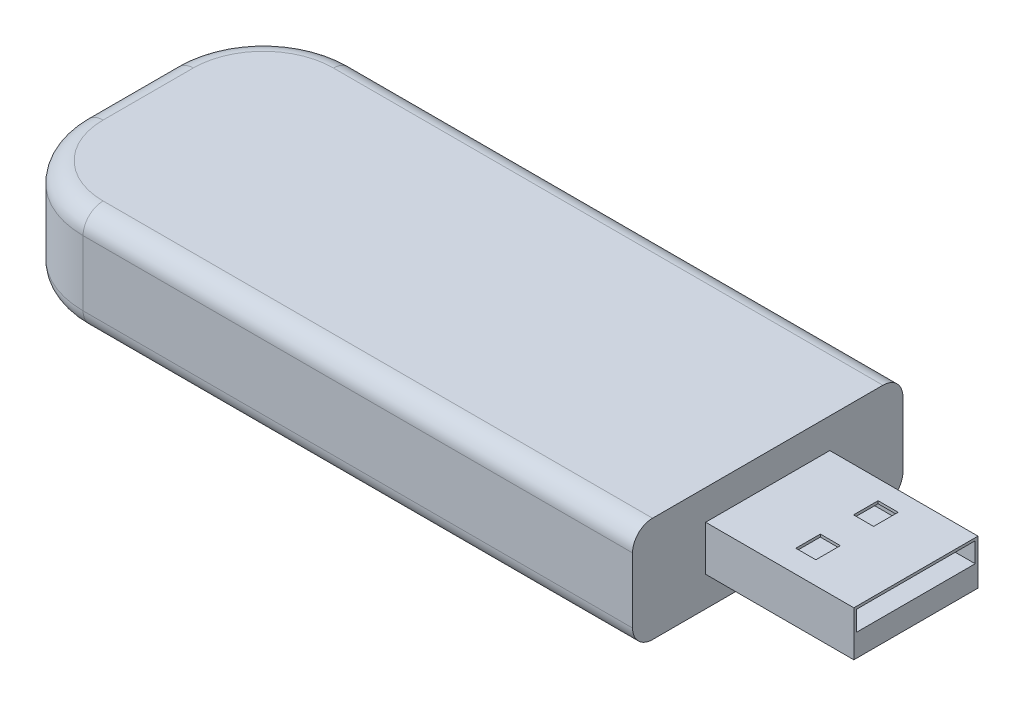
ISO-10303-21;
HEADER;
FILE_DESCRIPTION(('STEP AP214'),'2;1');
FILE_NAME('part.step','',(''),(''),'','','');
FILE_SCHEMA(('AUTOMOTIVE_DESIGN { 1 0 10303 214 1 1 1 1 }'));
ENDSEC;
DATA;
#1=APPLICATION_CONTEXT('core data for automotive mechanical design processes');
#2=APPLICATION_PROTOCOL_DEFINITION('international standard','automotive_design',2000,#1);
#3=PRODUCT_CONTEXT('',#1,'mechanical');
#4=PRODUCT('Part','Part','',(#3));
#5=PRODUCT_RELATED_PRODUCT_CATEGORY('part','',(#4));
#6=PRODUCT_DEFINITION_FORMATION('','',#4);
#7=PRODUCT_DEFINITION_CONTEXT('part definition',#1,'design');
#8=PRODUCT_DEFINITION('design','',#6,#7);
#9=PRODUCT_DEFINITION_SHAPE('','',#8);
#10=(LENGTH_UNIT() NAMED_UNIT(*) SI_UNIT(.MILLI.,.METRE.));
#11=(NAMED_UNIT(*) PLANE_ANGLE_UNIT() SI_UNIT($,.RADIAN.));
#12=(NAMED_UNIT(*) SI_UNIT($,.STERADIAN.) SOLID_ANGLE_UNIT());
#13=UNCERTAINTY_MEASURE_WITH_UNIT(LENGTH_MEASURE(1.E-05),#10,'distance_accuracy_value','');
#14=(GEOMETRIC_REPRESENTATION_CONTEXT(3) GLOBAL_UNCERTAINTY_ASSIGNED_CONTEXT((#13)) GLOBAL_UNIT_ASSIGNED_CONTEXT((#10,
#11,#12)) REPRESENTATION_CONTEXT('',''));
#15=CARTESIAN_POINT('',(0.,0.,0.));
#16=DIRECTION('',(0.,0.,1.));
#17=DIRECTION('',(1.,0.,0.));
#18=AXIS2_PLACEMENT_3D('',#15,#16,#17);
#19=CARTESIAN_POINT('',(-22.6633399773956,10.5,0.));
#20=DIRECTION('',(-1.,0.,0.));
#21=DIRECTION('',(0.,0.,1.));
#22=AXIS2_PLACEMENT_3D('',#19,#20,#21);
#23=PLANE('',#22);
#24=DIRECTION('',(0.,-1.,0.));
#25=VECTOR('',#24,1.);
#26=CARTESIAN_POINT('',(-22.6633399773956,10.5,-7.79044564041196));
#27=LINE('',#26,#25);
#28=CARTESIAN_POINT('',(-22.6633399773956,8.5,-7.79044564041196));
#29=VERTEX_POINT('',#28);
#30=CARTESIAN_POINT('',(-22.6633399773956,2.,-7.79044564041196));
#31=VERTEX_POINT('',#30);
#32=EDGE_CURVE('E349',#29,#31,#27,.T.);
#33=ORIENTED_EDGE('',*,*,#32,.F.);
#34=CARTESIAN_POINT('',(-22.6633399773956,8.5,-5.79044564041196));
#35=DIRECTION('',(-1.,0.,0.));
#36=DIRECTION('',(0.,0.,1.));
#37=AXIS2_PLACEMENT_3D('',#34,#35,#36);
#38=CIRCLE('',#37,2.);
#39=CARTESIAN_POINT('',(-22.6633399773956,10.5,-5.79044564041196));
#40=VERTEX_POINT('',#39);
#41=EDGE_CURVE('E388',#29,#40,#38,.F.);
#42=ORIENTED_EDGE('',*,*,#41,.T.);
#43=DIRECTION('',(0.,0.,-1.));
#44=VECTOR('',#43,1.);
#45=CARTESIAN_POINT('',(-22.6633399773956,10.5,0.));
#46=LINE('',#45,#44);
#47=CARTESIAN_POINT('',(-22.6633399773956,10.5,17.209554359588));
#48=VERTEX_POINT('',#47);
#49=EDGE_CURVE('E333',#48,#40,#46,.T.);
#50=ORIENTED_EDGE('',*,*,#49,.F.);
#51=CARTESIAN_POINT('',(-22.6633399773956,8.5,17.209554359588));
#52=DIRECTION('',(-1.,0.,0.));
#53=DIRECTION('',(0.,0.,1.));
#54=AXIS2_PLACEMENT_3D('',#51,#52,#53);
#55=CIRCLE('',#54,2.);
#56=CARTESIAN_POINT('',(-22.6633399773956,8.5,19.209554359588));
#57=VERTEX_POINT('',#56);
#58=EDGE_CURVE('E386',#48,#57,#55,.F.);
#59=ORIENTED_EDGE('',*,*,#58,.T.);
#60=DIRECTION('',(0.,-1.,0.));
#61=VECTOR('',#60,1.);
#62=CARTESIAN_POINT('',(-22.6633399773956,10.5,19.209554359588));
#63=LINE('',#62,#61);
#64=CARTESIAN_POINT('',(-22.6633399773956,2.,19.209554359588));
#65=VERTEX_POINT('',#64);
#66=EDGE_CURVE('E352',#57,#65,#63,.T.);
#67=ORIENTED_EDGE('',*,*,#66,.T.);
#68=CARTESIAN_POINT('',(-22.6633399773956,2.,17.209554359588));
#69=DIRECTION('',(-1.,0.,0.));
#70=DIRECTION('',(0.,0.,1.));
#71=AXIS2_PLACEMENT_3D('',#68,#69,#70);
#72=CIRCLE('',#71,2.);
#73=CARTESIAN_POINT('',(-22.6633399773956,0.,17.209554359588));
#74=VERTEX_POINT('',#73);
#75=EDGE_CURVE('E382',#65,#74,#72,.F.);
#76=ORIENTED_EDGE('',*,*,#75,.T.);
#77=DIRECTION('',(0.,0.,-1.));
#78=VECTOR('',#77,1.);
#79=CARTESIAN_POINT('',(-22.6633399773956,0.,0.));
#80=LINE('',#79,#78);
#81=CARTESIAN_POINT('',(-22.6633399773956,0.,-5.79044564041196));
#82=VERTEX_POINT('',#81);
#83=EDGE_CURVE('E337',#74,#82,#80,.T.);
#84=ORIENTED_EDGE('',*,*,#83,.T.);
#85=CARTESIAN_POINT('',(-22.6633399773956,2.,-5.79044564041196));
#86=DIRECTION('',(-1.,0.,0.));
#87=DIRECTION('',(0.,0.,1.));
#88=AXIS2_PLACEMENT_3D('',#85,#86,#87);
#89=CIRCLE('',#88,2.);
#90=EDGE_CURVE('E384',#82,#31,#89,.F.);
#91=ORIENTED_EDGE('',*,*,#90,.T.);
#92=EDGE_LOOP('',(#33,#42,#50,#59,#67,#76,#84,#91));
#93=FACE_BOUND('',#92,.T.);
#94=DIRECTION('',(0.,-1.,0.));
#95=VECTOR('',#94,1.);
#96=CARTESIAN_POINT('',(-22.6633399773956,7.5,11.909554359588));
#97=LINE('',#96,#95);
#98=CARTESIAN_POINT('',(-22.6633399773956,7.5,11.909554359588));
#99=VERTEX_POINT('',#98);
#100=CARTESIAN_POINT('',(-22.6633399773956,3.,11.909554359588));
#101=VERTEX_POINT('',#100);
#102=EDGE_CURVE('E299',#99,#101,#97,.T.);
#103=ORIENTED_EDGE('',*,*,#102,.F.);
#104=DIRECTION('',(0.,0.,1.));
#105=VECTOR('',#104,1.);
#106=CARTESIAN_POINT('',(-22.6633399773956,7.5,11.909554359588));
#107=LINE('',#106,#105);
#108=CARTESIAN_POINT('',(-22.6633399773956,7.5,-0.490445640411957));
#109=VERTEX_POINT('',#108);
#110=EDGE_CURVE('E304',#109,#99,#107,.T.);
#111=ORIENTED_EDGE('',*,*,#110,.F.);
#112=DIRECTION('',(0.,1.,0.));
#113=VECTOR('',#112,1.);
#114=CARTESIAN_POINT('',(-22.6633399773956,7.5,-0.490445640411957));
#115=LINE('',#114,#113);
#116=CARTESIAN_POINT('',(-22.6633399773956,3.,-0.490445640411957));
#117=VERTEX_POINT('',#116);
#118=EDGE_CURVE('E316',#117,#109,#115,.T.);
#119=ORIENTED_EDGE('',*,*,#118,.F.);
#120=DIRECTION('',(0.,0.,-1.));
#121=VECTOR('',#120,1.);
#122=CARTESIAN_POINT('',(-22.6633399773956,3.,11.909554359588));
#123=LINE('',#122,#121);
#124=EDGE_CURVE('E313',#101,#117,#123,.T.);
#125=ORIENTED_EDGE('',*,*,#124,.F.);
#126=EDGE_LOOP('',(#103,#111,#119,#125));
#127=FACE_BOUND('',#126,.T.);
#128=ADVANCED_FACE('F37',(#93,#127),#23,.F.);
#129=CARTESIAN_POINT('',(-77.5327588908546,10.5,10.209554359588));
#130=DIRECTION('',(0.,-1.,0.));
#131=DIRECTION('',(0.,0.,-1.));
#132=AXIS2_PLACEMENT_3D('',#129,#130,#131);
#133=CYLINDRICAL_SURFACE('',#132,9.00000000000001);
#134=DIRECTION('',(0.,-1.,0.));
#135=VECTOR('',#134,1.);
#136=CARTESIAN_POINT('',(-77.5327588908545,10.5,19.209554359588));
#137=LINE('',#136,#135);
#138=CARTESIAN_POINT('',(-77.5327588908545,8.5,19.209554359588));
#139=VERTEX_POINT('',#138);
#140=CARTESIAN_POINT('',(-77.5327588908545,2.,19.209554359588));
#141=VERTEX_POINT('',#140);
#142=EDGE_CURVE('E355',#139,#141,#137,.T.);
#143=ORIENTED_EDGE('',*,*,#142,.F.);
#144=CARTESIAN_POINT('',(-77.5327588908546,8.5,10.209554359588));
#145=DIRECTION('',(0.,1.,0.));
#146=DIRECTION('',(0.,0.,1.));
#147=AXIS2_PLACEMENT_3D('',#144,#145,#146);
#148=CIRCLE('',#147,9.00000000000001);
#149=CARTESIAN_POINT('',(-86.5327588908546,8.5,10.209554359588));
#150=VERTEX_POINT('',#149);
#151=EDGE_CURVE('E396',#139,#150,#148,.F.);
#152=ORIENTED_EDGE('',*,*,#151,.T.);
#153=DIRECTION('',(0.,-1.,0.));
#154=VECTOR('',#153,1.);
#155=CARTESIAN_POINT('',(-86.5327588908546,10.5,10.209554359588));
#156=LINE('',#155,#154);
#157=CARTESIAN_POINT('',(-86.5327588908546,2.,10.209554359588));
#158=VERTEX_POINT('',#157);
#159=EDGE_CURVE('E336',#150,#158,#156,.T.);
#160=ORIENTED_EDGE('',*,*,#159,.T.);
#161=CARTESIAN_POINT('',(-77.5327588908546,2.,10.209554359588));
#162=DIRECTION('',(0.,1.,0.));
#163=DIRECTION('',(0.,0.,1.));
#164=AXIS2_PLACEMENT_3D('',#161,#162,#163);
#165=CIRCLE('',#164,9.00000000000001);
#166=EDGE_CURVE('E394',#158,#141,#165,.T.);
#167=ORIENTED_EDGE('',*,*,#166,.T.);
#168=EDGE_LOOP('',(#143,#152,#160,#167));
#169=FACE_BOUND('',#168,.T.);
#170=ADVANCED_FACE('F462',(#169),#133,.T.);
#171=CARTESIAN_POINT('',(0.,10.5,19.209554359588));
#172=DIRECTION('',(0.,0.,-1.));
#173=DIRECTION('',(-1.,0.,0.));
#174=AXIS2_PLACEMENT_3D('',#171,#172,#173);
#175=PLANE('',#174);
#176=ORIENTED_EDGE('',*,*,#66,.F.);
#177=DIRECTION('',(1.,0.,0.));
#178=VECTOR('',#177,1.);
#179=CARTESIAN_POINT('',(-77.5327588908545,8.5,19.209554359588));
#180=LINE('',#179,#178);
#181=EDGE_CURVE('E392',#57,#139,#180,.F.);
#182=ORIENTED_EDGE('',*,*,#181,.T.);
#183=ORIENTED_EDGE('',*,*,#142,.T.);
#184=DIRECTION('',(1.,0.,0.));
#185=VECTOR('',#184,1.);
#186=CARTESIAN_POINT('',(0.,2.,19.209554359588));
#187=LINE('',#186,#185);
#188=EDGE_CURVE('E390',#141,#65,#187,.T.);
#189=ORIENTED_EDGE('',*,*,#188,.T.);
#190=EDGE_LOOP('',(#176,#182,#183,#189));
#191=FACE_BOUND('',#190,.T.);
#192=ADVANCED_FACE('F469',(#191),#175,.F.);
#193=CARTESIAN_POINT('',(0.,10.5,-7.79044564041196));
#194=DIRECTION('',(0.,0.,-1.));
#195=DIRECTION('',(-1.,0.,0.));
#196=AXIS2_PLACEMENT_3D('',#193,#194,#195);
#197=PLANE('',#196);
#198=DIRECTION('',(0.,-1.,0.));
#199=VECTOR('',#198,1.);
#200=CARTESIAN_POINT('',(-77.5327588908545,10.5,-7.79044564041196));
#201=LINE('',#200,#199);
#202=CARTESIAN_POINT('',(-77.5327588908545,8.5,-7.79044564041196));
#203=VERTEX_POINT('',#202);
#204=CARTESIAN_POINT('',(-77.5327588908545,2.,-7.79044564041196));
#205=VERTEX_POINT('',#204);
#206=EDGE_CURVE('E346',#203,#205,#201,.T.);
#207=ORIENTED_EDGE('',*,*,#206,.F.);
#208=DIRECTION('',(1.,0.,0.));
#209=VECTOR('',#208,1.);
#210=CARTESIAN_POINT('',(0.,8.5,-7.79044564041196));
#211=LINE('',#210,#209);
#212=EDGE_CURVE('E380',#203,#29,#211,.T.);
#213=ORIENTED_EDGE('',*,*,#212,.T.);
#214=ORIENTED_EDGE('',*,*,#32,.T.);
#215=DIRECTION('',(1.,0.,0.));
#216=VECTOR('',#215,1.);
#217=CARTESIAN_POINT('',(-77.5327588908545,2.,-7.79044564041196));
#218=LINE('',#217,#216);
#219=EDGE_CURVE('E378',#31,#205,#218,.F.);
#220=ORIENTED_EDGE('',*,*,#219,.T.);
#221=EDGE_LOOP('',(#207,#213,#214,#220));
#222=FACE_BOUND('',#221,.T.);
#223=ADVANCED_FACE('F548',(#222),#197,.T.);
#224=CARTESIAN_POINT('',(-77.5327588908546,10.5,1.20955435958804));
#225=DIRECTION('',(0.,-1.,0.));
#226=DIRECTION('',(0.,0.,-1.));
#227=AXIS2_PLACEMENT_3D('',#224,#225,#226);
#228=CYLINDRICAL_SURFACE('',#227,9.);
#229=DIRECTION('',(0.,-1.,0.));
#230=VECTOR('',#229,1.);
#231=CARTESIAN_POINT('',(-86.5327588908546,10.5,1.20955435958811));
#232=LINE('',#231,#230);
#233=CARTESIAN_POINT('',(-86.5327588908546,8.5,1.20955435958811));
#234=VERTEX_POINT('',#233);
#235=CARTESIAN_POINT('',(-86.5327588908546,2.,1.20955435958811));
#236=VERTEX_POINT('',#235);
#237=EDGE_CURVE('E343',#234,#236,#232,.T.);
#238=ORIENTED_EDGE('',*,*,#237,.F.);
#239=CARTESIAN_POINT('',(-77.5327588908546,8.5,1.20955435958804));
#240=DIRECTION('',(0.,1.,0.));
#241=DIRECTION('',(0.,0.,1.));
#242=AXIS2_PLACEMENT_3D('',#239,#240,#241);
#243=CIRCLE('',#242,9.);
#244=EDGE_CURVE('E376',#234,#203,#243,.F.);
#245=ORIENTED_EDGE('',*,*,#244,.T.);
#246=ORIENTED_EDGE('',*,*,#206,.T.);
#247=CARTESIAN_POINT('',(-77.5327588908546,2.,1.20955435958804));
#248=DIRECTION('',(0.,1.,0.));
#249=DIRECTION('',(0.,0.,1.));
#250=AXIS2_PLACEMENT_3D('',#247,#248,#249);
#251=CIRCLE('',#250,9.);
#252=EDGE_CURVE('E374',#205,#236,#251,.T.);
#253=ORIENTED_EDGE('',*,*,#252,.T.);
#254=EDGE_LOOP('',(#238,#245,#246,#253));
#255=FACE_BOUND('',#254,.T.);
#256=ADVANCED_FACE('F545',(#255),#228,.T.);
#257=CARTESIAN_POINT('',(-86.5327588908546,10.5,0.));
#258=DIRECTION('',(1.,0.,0.));
#259=DIRECTION('',(0.,0.,-1.));
#260=AXIS2_PLACEMENT_3D('',#257,#258,#259);
#261=PLANE('',#260);
#262=ORIENTED_EDGE('',*,*,#159,.F.);
#263=DIRECTION('',(0.,0.,1.));
#264=VECTOR('',#263,1.);
#265=CARTESIAN_POINT('',(-86.5327588908546,8.5,1.20955435958811));
#266=LINE('',#265,#264);
#267=EDGE_CURVE('E372',#150,#234,#266,.F.);
#268=ORIENTED_EDGE('',*,*,#267,.T.);
#269=ORIENTED_EDGE('',*,*,#237,.T.);
#270=DIRECTION('',(0.,0.,1.));
#271=VECTOR('',#270,1.);
#272=CARTESIAN_POINT('',(-86.5327588908546,2.,0.));
#273=LINE('',#272,#271);
#274=EDGE_CURVE('E369',#236,#158,#273,.T.);
#275=ORIENTED_EDGE('',*,*,#274,.T.);
#276=EDGE_LOOP('',(#262,#268,#269,#275));
#277=FACE_BOUND('',#276,.T.);
#278=ADVANCED_FACE('F537',(#277),#261,.F.);
#279=CARTESIAN_POINT('',(0.,10.5,0.));
#280=DIRECTION('',(0.,1.,0.));
#281=DIRECTION('',(0.,0.,1.));
#282=AXIS2_PLACEMENT_3D('',#279,#280,#281);
#283=PLANE('',#282);
#284=ORIENTED_EDGE('',*,*,#49,.T.);
#285=DIRECTION('',(1.,0.,0.));
#286=VECTOR('',#285,1.);
#287=CARTESIAN_POINT('',(0.,10.5,-5.79044564041196));
#288=LINE('',#287,#286);
#289=CARTESIAN_POINT('',(-77.5327588908545,10.5,-5.79044564041195));
#290=VERTEX_POINT('',#289);
#291=EDGE_CURVE('E367',#40,#290,#288,.F.);
#292=ORIENTED_EDGE('',*,*,#291,.T.);
#293=CARTESIAN_POINT('',(-77.5327588908546,10.5,1.20955435958804));
#294=DIRECTION('',(0.,1.,0.));
#295=DIRECTION('',(0.,0.,1.));
#296=AXIS2_PLACEMENT_3D('',#293,#294,#295);
#297=CIRCLE('',#296,7.);
#298=CARTESIAN_POINT('',(-84.5327588908546,10.5,1.20955435958811));
#299=VERTEX_POINT('',#298);
#300=EDGE_CURVE('E365',#290,#299,#297,.T.);
#301=ORIENTED_EDGE('',*,*,#300,.T.);
#302=DIRECTION('',(0.,0.,1.));
#303=VECTOR('',#302,1.);
#304=CARTESIAN_POINT('',(-84.5327588908546,10.5,10.209554359588));
#305=LINE('',#304,#303);
#306=CARTESIAN_POINT('',(-84.5327588908546,10.5,10.209554359588));
#307=VERTEX_POINT('',#306);
#308=EDGE_CURVE('E362',#299,#307,#305,.T.);
#309=ORIENTED_EDGE('',*,*,#308,.T.);
#310=CARTESIAN_POINT('',(-77.5327588908546,10.5,10.209554359588));
#311=DIRECTION('',(0.,1.,0.));
#312=DIRECTION('',(0.,0.,1.));
#313=AXIS2_PLACEMENT_3D('',#310,#311,#312);
#314=CIRCLE('',#313,7.);
#315=CARTESIAN_POINT('',(-77.5327588908545,10.5,17.209554359588));
#316=VERTEX_POINT('',#315);
#317=EDGE_CURVE('E358',#307,#316,#314,.T.);
#318=ORIENTED_EDGE('',*,*,#317,.T.);
#319=DIRECTION('',(1.,0.,0.));
#320=VECTOR('',#319,1.);
#321=CARTESIAN_POINT('',(-22.6633399773956,10.5,17.209554359588));
#322=LINE('',#321,#320);
#323=EDGE_CURVE('E360',#316,#48,#322,.T.);
#324=ORIENTED_EDGE('',*,*,#323,.T.);
#325=EDGE_LOOP('',(#284,#292,#301,#309,#318,#324));
#326=FACE_BOUND('',#325,.T.);
#327=ADVANCED_FACE('F533',(#326),#283,.T.);
#328=CARTESIAN_POINT('',(0.,0.,0.));
#329=DIRECTION('',(0.,1.,0.));
#330=DIRECTION('',(0.,0.,1.));
#331=AXIS2_PLACEMENT_3D('',#328,#329,#330);
#332=PLANE('',#331);
#333=CARTESIAN_POINT('',(-77.5327588908546,0.,1.20955435958804));
#334=DIRECTION('',(0.,1.,0.));
#335=DIRECTION('',(0.,0.,1.));
#336=AXIS2_PLACEMENT_3D('',#333,#334,#335);
#337=CIRCLE('',#336,7.);
#338=CARTESIAN_POINT('',(-84.5327588908546,0.,1.20955435958811));
#339=VERTEX_POINT('',#338);
#340=CARTESIAN_POINT('',(-77.5327588908545,0.,-5.79044564041195));
#341=VERTEX_POINT('',#340);
#342=EDGE_CURVE('E404',#339,#341,#337,.F.);
#343=ORIENTED_EDGE('',*,*,#342,.T.);
#344=DIRECTION('',(1.,0.,0.));
#345=VECTOR('',#344,1.);
#346=CARTESIAN_POINT('',(-22.6633399773956,0.,-5.79044564041196));
#347=LINE('',#346,#345);
#348=EDGE_CURVE('E406',#341,#82,#347,.T.);
#349=ORIENTED_EDGE('',*,*,#348,.T.);
#350=ORIENTED_EDGE('',*,*,#83,.F.);
#351=DIRECTION('',(1.,0.,0.));
#352=VECTOR('',#351,1.);
#353=CARTESIAN_POINT('',(0.,0.,17.209554359588));
#354=LINE('',#353,#352);
#355=CARTESIAN_POINT('',(-77.5327588908545,0.,17.209554359588));
#356=VERTEX_POINT('',#355);
#357=EDGE_CURVE('E400',#74,#356,#354,.F.);
#358=ORIENTED_EDGE('',*,*,#357,.T.);
#359=CARTESIAN_POINT('',(-77.5327588908546,0.,10.209554359588));
#360=DIRECTION('',(0.,1.,0.));
#361=DIRECTION('',(0.,0.,1.));
#362=AXIS2_PLACEMENT_3D('',#359,#360,#361);
#363=CIRCLE('',#362,7.);
#364=CARTESIAN_POINT('',(-84.5327588908546,0.,10.209554359588));
#365=VERTEX_POINT('',#364);
#366=EDGE_CURVE('E398',#356,#365,#363,.F.);
#367=ORIENTED_EDGE('',*,*,#366,.T.);
#368=DIRECTION('',(0.,0.,1.));
#369=VECTOR('',#368,1.);
#370=CARTESIAN_POINT('',(-84.5327588908546,0.,0.));
#371=LINE('',#370,#369);
#372=EDGE_CURVE('E402',#365,#339,#371,.F.);
#373=ORIENTED_EDGE('',*,*,#372,.T.);
#374=EDGE_LOOP('',(#343,#349,#350,#358,#367,#373));
#375=FACE_BOUND('',#374,.T.);
#376=ADVANCED_FACE('F536',(#375),#332,.F.);
#377=CARTESIAN_POINT('',(0.,8.5,-5.79044564041196));
#378=DIRECTION('',(1.,0.,0.));
#379=DIRECTION('',(0.,0.,-1.));
#380=AXIS2_PLACEMENT_3D('',#377,#378,#379);
#381=CYLINDRICAL_SURFACE('',#380,2.);
#382=ORIENTED_EDGE('',*,*,#41,.F.);
#383=ORIENTED_EDGE('',*,*,#212,.F.);
#384=CARTESIAN_POINT('',(-77.5327588908545,8.5,-5.79044564041196));
#385=DIRECTION('',(-1.,0.,0.));
#386=DIRECTION('',(0.,0.,1.));
#387=AXIS2_PLACEMENT_3D('',#384,#385,#386);
#388=CIRCLE('',#387,2.);
#389=EDGE_CURVE('E340',#290,#203,#388,.T.);
#390=ORIENTED_EDGE('',*,*,#389,.F.);
#391=ORIENTED_EDGE('',*,*,#291,.F.);
#392=EDGE_LOOP('',(#382,#383,#390,#391));
#393=FACE_BOUND('',#392,.T.);
#394=ADVANCED_FACE('F541',(#393),#381,.T.);
#395=CARTESIAN_POINT('',(0.,8.5,17.209554359588));
#396=DIRECTION('',(-1.,0.,0.));
#397=DIRECTION('',(0.,0.,1.));
#398=AXIS2_PLACEMENT_3D('',#395,#396,#397);
#399=CYLINDRICAL_SURFACE('',#398,2.);
#400=ORIENTED_EDGE('',*,*,#58,.F.);
#401=ORIENTED_EDGE('',*,*,#323,.F.);
#402=CARTESIAN_POINT('',(-77.5327588908545,8.5,17.209554359588));
#403=DIRECTION('',(-1.,0.,0.));
#404=DIRECTION('',(0.,0.,1.));
#405=AXIS2_PLACEMENT_3D('',#402,#403,#404);
#406=CIRCLE('',#405,2.);
#407=EDGE_CURVE('E415',#139,#316,#406,.T.);
#408=ORIENTED_EDGE('',*,*,#407,.F.);
#409=ORIENTED_EDGE('',*,*,#181,.F.);
#410=EDGE_LOOP('',(#400,#401,#408,#409));
#411=FACE_BOUND('',#410,.T.);
#412=ADVANCED_FACE('F576',(#411),#399,.T.);
#413=CARTESIAN_POINT('',(-77.5327588908546,8.5,1.20955435958804));
#414=DIRECTION('',(0.,1.,0.));
#415=DIRECTION('',(0.,0.,1.));
#416=AXIS2_PLACEMENT_3D('',#413,#414,#415);
#417=TOROIDAL_SURFACE('',#416,7.,2.);
#418=ORIENTED_EDGE('',*,*,#389,.T.);
#419=ORIENTED_EDGE('',*,*,#244,.F.);
#420=CARTESIAN_POINT('',(-84.5327588908546,8.5,1.20955435958811));
#421=DIRECTION('',(0.,0.,1.));
#422=DIRECTION('',(1.,0.,0.));
#423=AXIS2_PLACEMENT_3D('',#420,#421,#422);
#424=CIRCLE('',#423,2.);
#425=EDGE_CURVE('E411',#299,#234,#424,.T.);
#426=ORIENTED_EDGE('',*,*,#425,.F.);
#427=ORIENTED_EDGE('',*,*,#300,.F.);
#428=EDGE_LOOP('',(#418,#419,#426,#427));
#429=FACE_BOUND('',#428,.T.);
#430=ADVANCED_FACE('F567',(#429),#417,.T.);
#431=CARTESIAN_POINT('',(-77.5327588908546,8.5,10.209554359588));
#432=DIRECTION('',(0.,1.,0.));
#433=DIRECTION('',(0.,0.,1.));
#434=AXIS2_PLACEMENT_3D('',#431,#432,#433);
#435=TOROIDAL_SURFACE('',#434,7.,2.);
#436=ORIENTED_EDGE('',*,*,#407,.T.);
#437=ORIENTED_EDGE('',*,*,#317,.F.);
#438=CARTESIAN_POINT('',(-84.5327588908546,8.5,10.209554359588));
#439=DIRECTION('',(0.,0.,-1.));
#440=DIRECTION('',(0.,1.,0.));
#441=AXIS2_PLACEMENT_3D('',#438,#439,#440);
#442=CIRCLE('',#441,2.);
#443=EDGE_CURVE('E409',#150,#307,#442,.T.);
#444=ORIENTED_EDGE('',*,*,#443,.F.);
#445=ORIENTED_EDGE('',*,*,#151,.F.);
#446=EDGE_LOOP('',(#436,#437,#444,#445));
#447=FACE_BOUND('',#446,.T.);
#448=ADVANCED_FACE('F624',(#447),#435,.T.);
#449=CARTESIAN_POINT('',(-84.5327588908546,8.5,0.));
#450=DIRECTION('',(0.,0.,-1.));
#451=DIRECTION('',(-1.,0.,0.));
#452=AXIS2_PLACEMENT_3D('',#449,#450,#451);
#453=CYLINDRICAL_SURFACE('',#452,2.);
#454=ORIENTED_EDGE('',*,*,#425,.T.);
#455=ORIENTED_EDGE('',*,*,#267,.F.);
#456=ORIENTED_EDGE('',*,*,#443,.T.);
#457=ORIENTED_EDGE('',*,*,#308,.F.);
#458=EDGE_LOOP('',(#454,#455,#456,#457));
#459=FACE_BOUND('',#458,.T.);
#460=ADVANCED_FACE('F612',(#459),#453,.T.);
#461=CARTESIAN_POINT('',(0.,2.,-5.79044564041196));
#462=DIRECTION('',(-1.,0.,0.));
#463=DIRECTION('',(0.,0.,1.));
#464=AXIS2_PLACEMENT_3D('',#461,#462,#463);
#465=CYLINDRICAL_SURFACE('',#464,2.);
#466=ORIENTED_EDGE('',*,*,#90,.F.);
#467=ORIENTED_EDGE('',*,*,#348,.F.);
#468=CARTESIAN_POINT('',(-77.5327588908545,2.,-5.79044564041196));
#469=DIRECTION('',(-1.,0.,0.));
#470=DIRECTION('',(0.,-1.,0.));
#471=AXIS2_PLACEMENT_3D('',#468,#469,#470);
#472=CIRCLE('',#471,2.);
#473=EDGE_CURVE('E412',#205,#341,#472,.T.);
#474=ORIENTED_EDGE('',*,*,#473,.F.);
#475=ORIENTED_EDGE('',*,*,#219,.F.);
#476=EDGE_LOOP('',(#466,#467,#474,#475));
#477=FACE_BOUND('',#476,.T.);
#478=ADVANCED_FACE('F39',(#477),#465,.T.);
#479=CARTESIAN_POINT('',(0.,2.,17.209554359588));
#480=DIRECTION('',(1.,0.,0.));
#481=DIRECTION('',(0.,0.,-1.));
#482=AXIS2_PLACEMENT_3D('',#479,#480,#481);
#483=CYLINDRICAL_SURFACE('',#482,2.);
#484=ORIENTED_EDGE('',*,*,#75,.F.);
#485=ORIENTED_EDGE('',*,*,#188,.F.);
#486=CARTESIAN_POINT('',(-77.5327588908545,2.,17.209554359588));
#487=DIRECTION('',(-1.,0.,0.));
#488=DIRECTION('',(0.,0.,1.));
#489=AXIS2_PLACEMENT_3D('',#486,#487,#488);
#490=CIRCLE('',#489,2.);
#491=EDGE_CURVE('E424',#356,#141,#490,.T.);
#492=ORIENTED_EDGE('',*,*,#491,.F.);
#493=ORIENTED_EDGE('',*,*,#357,.F.);
#494=EDGE_LOOP('',(#484,#485,#492,#493));
#495=FACE_BOUND('',#494,.T.);
#496=ADVANCED_FACE('F605',(#495),#483,.T.);
#497=CARTESIAN_POINT('',(-77.5327588908546,2.,1.20955435958804));
#498=DIRECTION('',(0.,1.,0.));
#499=DIRECTION('',(0.,0.,1.));
#500=AXIS2_PLACEMENT_3D('',#497,#498,#499);
#501=TOROIDAL_SURFACE('',#500,7.,2.);
#502=ORIENTED_EDGE('',*,*,#473,.T.);
#503=ORIENTED_EDGE('',*,*,#342,.F.);
#504=CARTESIAN_POINT('',(-84.5327588908546,2.,1.20955435958809));
#505=DIRECTION('',(0.,0.,1.));
#506=DIRECTION('',(0.,-1.,0.));
#507=AXIS2_PLACEMENT_3D('',#504,#505,#506);
#508=CIRCLE('',#507,2.);
#509=EDGE_CURVE('E421',#236,#339,#508,.T.);
#510=ORIENTED_EDGE('',*,*,#509,.F.);
#511=ORIENTED_EDGE('',*,*,#252,.F.);
#512=EDGE_LOOP('',(#502,#503,#510,#511));
#513=FACE_BOUND('',#512,.T.);
#514=ADVANCED_FACE('F597',(#513),#501,.T.);
#515=CARTESIAN_POINT('',(-77.5327588908546,2.,10.209554359588));
#516=DIRECTION('',(0.,1.,0.));
#517=DIRECTION('',(0.,0.,1.));
#518=AXIS2_PLACEMENT_3D('',#515,#516,#517);
#519=TOROIDAL_SURFACE('',#518,7.,2.);
#520=ORIENTED_EDGE('',*,*,#491,.T.);
#521=ORIENTED_EDGE('',*,*,#166,.F.);
#522=CARTESIAN_POINT('',(-84.5327588908546,2.,10.209554359588));
#523=DIRECTION('',(0.,0.,-1.));
#524=DIRECTION('',(-1.,0.,0.));
#525=AXIS2_PLACEMENT_3D('',#522,#523,#524);
#526=CIRCLE('',#525,2.);
#527=EDGE_CURVE('E332',#365,#158,#526,.T.);
#528=ORIENTED_EDGE('',*,*,#527,.F.);
#529=ORIENTED_EDGE('',*,*,#366,.F.);
#530=EDGE_LOOP('',(#520,#521,#528,#529));
#531=FACE_BOUND('',#530,.T.);
#532=ADVANCED_FACE('F585',(#531),#519,.T.);
#533=CARTESIAN_POINT('',(-84.5327588908546,2.,0.));
#534=DIRECTION('',(0.,0.,1.));
#535=DIRECTION('',(1.,0.,0.));
#536=AXIS2_PLACEMENT_3D('',#533,#534,#535);
#537=CYLINDRICAL_SURFACE('',#536,2.);
#538=ORIENTED_EDGE('',*,*,#509,.T.);
#539=ORIENTED_EDGE('',*,*,#372,.F.);
#540=ORIENTED_EDGE('',*,*,#527,.T.);
#541=ORIENTED_EDGE('',*,*,#274,.F.);
#542=EDGE_LOOP('',(#538,#539,#540,#541));
#543=FACE_BOUND('',#542,.T.);
#544=ADVANCED_FACE('F518',(#543),#537,.T.);
#545=CARTESIAN_POINT('',(-7.86333997739558,0.,0.));
#546=DIRECTION('',(1.,0.,0.));
#547=DIRECTION('',(0.,0.,-1.));
#548=AXIS2_PLACEMENT_3D('',#545,#546,#547);
#549=PLANE('',#548);
#550=DIRECTION('',(0.,-1.,0.));
#551=VECTOR('',#550,1.);
#552=CARTESIAN_POINT('',(-7.86333997739558,7.5,11.909554359588));
#553=LINE('',#552,#551);
#554=CARTESIAN_POINT('',(-7.86333997739558,7.5,11.909554359588));
#555=VERTEX_POINT('',#554);
#556=CARTESIAN_POINT('',(-7.86333997739558,3.,11.909554359588));
#557=VERTEX_POINT('',#556);
#558=EDGE_CURVE('E300',#555,#557,#553,.T.);
#559=ORIENTED_EDGE('',*,*,#558,.T.);
#560=DIRECTION('',(0.,0.,-1.));
#561=VECTOR('',#560,1.);
#562=CARTESIAN_POINT('',(-7.86333997739558,3.,11.909554359588));
#563=LINE('',#562,#561);
#564=CARTESIAN_POINT('',(-7.86333997739558,3.,-0.490445640411957));
#565=VERTEX_POINT('',#564);
#566=EDGE_CURVE('E303',#557,#565,#563,.T.);
#567=ORIENTED_EDGE('',*,*,#566,.T.);
#568=DIRECTION('',(0.,1.,0.));
#569=VECTOR('',#568,1.);
#570=CARTESIAN_POINT('',(-7.86333997739558,7.5,-0.490445640411957));
#571=LINE('',#570,#569);
#572=CARTESIAN_POINT('',(-7.86333997739558,7.5,-0.490445640411957));
#573=VERTEX_POINT('',#572);
#574=EDGE_CURVE('E306',#565,#573,#571,.T.);
#575=ORIENTED_EDGE('',*,*,#574,.T.);
#576=DIRECTION('',(0.,0.,1.));
#577=VECTOR('',#576,1.);
#578=CARTESIAN_POINT('',(-7.86333997739558,7.5,11.909554359588));
#579=LINE('',#578,#577);
#580=EDGE_CURVE('E308',#573,#555,#579,.T.);
#581=ORIENTED_EDGE('',*,*,#580,.T.);
#582=EDGE_LOOP('',(#559,#567,#575,#581));
#583=FACE_BOUND('',#582,.T.);
#584=DIRECTION('',(0.,0.,-1.));
#585=VECTOR('',#584,1.);
#586=CARTESIAN_POINT('',(-7.86333997739558,5.25,11.6442906071869));
#587=LINE('',#586,#585);
#588=CARTESIAN_POINT('',(-7.86333997739558,5.25,11.6442906071869));
#589=VERTEX_POINT('',#588);
#590=CARTESIAN_POINT('',(-7.86333997739558,5.25,-0.210277268265162));
#591=VERTEX_POINT('',#590);
#592=EDGE_CURVE('E272',#589,#591,#587,.T.);
#593=ORIENTED_EDGE('',*,*,#592,.F.);
#594=DIRECTION('',(0.,-1.,0.));
#595=VECTOR('',#594,1.);
#596=CARTESIAN_POINT('',(-7.86333997739558,7.23861045067472,11.6442906071869));
#597=LINE('',#596,#595);
#598=CARTESIAN_POINT('',(-7.86333997739558,7.23861045067472,11.6442906071869));
#599=VERTEX_POINT('',#598);
#600=EDGE_CURVE('E270',#599,#589,#597,.T.);
#601=ORIENTED_EDGE('',*,*,#600,.F.);
#602=DIRECTION('',(0.,0.,1.));
#603=VECTOR('',#602,1.);
#604=CARTESIAN_POINT('',(-7.86333997739558,7.23861045067472,11.6442906071869));
#605=LINE('',#604,#603);
#606=CARTESIAN_POINT('',(-7.86333997739558,7.23861045067472,-0.210277268265162));
#607=VERTEX_POINT('',#606);
#608=EDGE_CURVE('E278',#607,#599,#605,.T.);
#609=ORIENTED_EDGE('',*,*,#608,.F.);
#610=DIRECTION('',(0.,1.,0.));
#611=VECTOR('',#610,1.);
#612=CARTESIAN_POINT('',(-7.86333997739558,7.23861045067472,-0.210277268265162));
#613=LINE('',#612,#611);
#614=EDGE_CURVE('E275',#591,#607,#613,.T.);
#615=ORIENTED_EDGE('',*,*,#614,.F.);
#616=EDGE_LOOP('',(#593,#601,#609,#615));
#617=FACE_BOUND('',#616,.T.);
#618=ADVANCED_FACE('F504',(#583,#617),#549,.T.);
#619=CARTESIAN_POINT('',(-7.86333997739558,7.5,11.909554359588));
#620=DIRECTION('',(0.,0.,-1.));
#621=DIRECTION('',(0.,1.,0.));
#622=AXIS2_PLACEMENT_3D('',#619,#620,#621);
#623=PLANE('',#622);
#624=ORIENTED_EDGE('',*,*,#102,.T.);
#625=DIRECTION('',(-1.,0.,0.));
#626=VECTOR('',#625,1.);
#627=CARTESIAN_POINT('',(-7.86333997739558,3.,11.909554359588));
#628=LINE('',#627,#626);
#629=EDGE_CURVE('E329',#557,#101,#628,.T.);
#630=ORIENTED_EDGE('',*,*,#629,.F.);
#631=ORIENTED_EDGE('',*,*,#558,.F.);
#632=DIRECTION('',(-1.,0.,0.));
#633=VECTOR('',#632,1.);
#634=CARTESIAN_POINT('',(-7.86333997739558,7.5,11.909554359588));
#635=LINE('',#634,#633);
#636=EDGE_CURVE('E310',#555,#99,#635,.T.);
#637=ORIENTED_EDGE('',*,*,#636,.T.);
#638=EDGE_LOOP('',(#624,#630,#631,#637));
#639=FACE_BOUND('',#638,.T.);
#640=ADVANCED_FACE('F517',(#639),#623,.F.);
#641=CARTESIAN_POINT('',(-7.86333997739558,3.,11.909554359588));
#642=DIRECTION('',(0.,1.,0.));
#643=DIRECTION('',(0.,0.,1.));
#644=AXIS2_PLACEMENT_3D('',#641,#642,#643);
#645=PLANE('',#644);
#646=ORIENTED_EDGE('',*,*,#124,.T.);
#647=DIRECTION('',(-1.,0.,0.));
#648=VECTOR('',#647,1.);
#649=CARTESIAN_POINT('',(-7.86333997739558,3.,-0.490445640411957));
#650=LINE('',#649,#648);
#651=EDGE_CURVE('E326',#565,#117,#650,.T.);
#652=ORIENTED_EDGE('',*,*,#651,.F.);
#653=ORIENTED_EDGE('',*,*,#566,.F.);
#654=ORIENTED_EDGE('',*,*,#629,.T.);
#655=EDGE_LOOP('',(#646,#652,#653,#654));
#656=FACE_BOUND('',#655,.T.);
#657=ADVANCED_FACE('F525',(#656),#645,.F.);
#658=CARTESIAN_POINT('',(-7.86333997739558,7.5,-0.490445640411957));
#659=DIRECTION('',(0.,0.,1.));
#660=DIRECTION('',(1.,0.,0.));
#661=AXIS2_PLACEMENT_3D('',#658,#659,#660);
#662=PLANE('',#661);
#663=ORIENTED_EDGE('',*,*,#118,.T.);
#664=DIRECTION('',(-1.,0.,0.));
#665=VECTOR('',#664,1.);
#666=CARTESIAN_POINT('',(-7.86333997739558,7.5,-0.490445640411957));
#667=LINE('',#666,#665);
#668=EDGE_CURVE('E323',#573,#109,#667,.T.);
#669=ORIENTED_EDGE('',*,*,#668,.F.);
#670=ORIENTED_EDGE('',*,*,#574,.F.);
#671=ORIENTED_EDGE('',*,*,#651,.T.);
#672=EDGE_LOOP('',(#663,#669,#670,#671));
#673=FACE_BOUND('',#672,.T.);
#674=ADVANCED_FACE('F522',(#673),#662,.F.);
#675=CARTESIAN_POINT('',(-7.86333997739558,7.5,11.909554359588));
#676=DIRECTION('',(0.,-1.,0.));
#677=DIRECTION('',(0.,0.,-1.));
#678=AXIS2_PLACEMENT_3D('',#675,#676,#677);
#679=PLANE('',#678);
#680=DIRECTION('',(1.,0.,0.));
#681=VECTOR('',#680,1.);
#682=CARTESIAN_POINT('',(-15.9134332070927,7.5,9.65495935331327));
#683=LINE('',#682,#681);
#684=CARTESIAN_POINT('',(-15.9134332070927,7.5,9.65495935331327));
#685=VERTEX_POINT('',#684);
#686=CARTESIAN_POINT('',(-13.9134332070927,7.5,9.65495935331327));
#687=VERTEX_POINT('',#686);
#688=EDGE_CURVE('E233',#685,#687,#683,.T.);
#689=ORIENTED_EDGE('',*,*,#688,.F.);
#690=DIRECTION('',(0.,0.,1.));
#691=VECTOR('',#690,1.);
#692=CARTESIAN_POINT('',(-15.9134332070927,7.5,7.20495935331327));
#693=LINE('',#692,#691);
#694=CARTESIAN_POINT('',(-15.9134332070927,7.5,7.20495935331327));
#695=VERTEX_POINT('',#694);
#696=EDGE_CURVE('E52',#695,#685,#693,.T.);
#697=ORIENTED_EDGE('',*,*,#696,.F.);
#698=DIRECTION('',(-1.,0.,0.));
#699=VECTOR('',#698,1.);
#700=CARTESIAN_POINT('',(-15.9134332070927,7.5,7.20495935331327));
#701=LINE('',#700,#699);
#702=CARTESIAN_POINT('',(-13.9134332070927,7.5,7.20495935331327));
#703=VERTEX_POINT('',#702);
#704=EDGE_CURVE('E240',#703,#695,#701,.T.);
#705=ORIENTED_EDGE('',*,*,#704,.F.);
#706=DIRECTION('',(0.,0.,-1.));
#707=VECTOR('',#706,1.);
#708=CARTESIAN_POINT('',(-13.9134332070927,7.5,7.20495935331327));
#709=LINE('',#708,#707);
#710=EDGE_CURVE('E224',#687,#703,#709,.T.);
#711=ORIENTED_EDGE('',*,*,#710,.F.);
#712=EDGE_LOOP('',(#689,#697,#705,#711));
#713=FACE_BOUND('',#712,.T.);
#714=DIRECTION('',(1.,0.,0.));
#715=VECTOR('',#714,1.);
#716=CARTESIAN_POINT('',(-15.9134332070927,7.5,3.88507176073274));
#717=LINE('',#716,#715);
#718=CARTESIAN_POINT('',(-15.9134332070927,7.5,3.88507176073274));
#719=VERTEX_POINT('',#718);
#720=CARTESIAN_POINT('',(-13.9134332070927,7.5,3.88507176073274));
#721=VERTEX_POINT('',#720);
#722=EDGE_CURVE('E251',#719,#721,#717,.T.);
#723=ORIENTED_EDGE('',*,*,#722,.F.);
#724=DIRECTION('',(0.,0.,1.));
#725=VECTOR('',#724,1.);
#726=CARTESIAN_POINT('',(-15.9134332070927,7.5,1.43507176073274));
#727=LINE('',#726,#725);
#728=CARTESIAN_POINT('',(-15.9134332070927,7.5,1.43507176073274));
#729=VERTEX_POINT('',#728);
#730=EDGE_CURVE('E247',#729,#719,#727,.T.);
#731=ORIENTED_EDGE('',*,*,#730,.F.);
#732=DIRECTION('',(-1.,0.,0.));
#733=VECTOR('',#732,1.);
#734=CARTESIAN_POINT('',(-15.9134332070927,7.5,1.43507176073274));
#735=LINE('',#734,#733);
#736=CARTESIAN_POINT('',(-13.9134332070927,7.5,1.43507176073274));
#737=VERTEX_POINT('',#736);
#738=EDGE_CURVE('E257',#737,#729,#735,.T.);
#739=ORIENTED_EDGE('',*,*,#738,.F.);
#740=DIRECTION('',(0.,0.,-1.));
#741=VECTOR('',#740,1.);
#742=CARTESIAN_POINT('',(-13.9134332070927,7.5,1.43507176073274));
#743=LINE('',#742,#741);
#744=EDGE_CURVE('E254',#721,#737,#743,.T.);
#745=ORIENTED_EDGE('',*,*,#744,.F.);
#746=EDGE_LOOP('',(#723,#731,#739,#745));
#747=FACE_BOUND('',#746,.T.);
#748=ORIENTED_EDGE('',*,*,#110,.T.);
#749=ORIENTED_EDGE('',*,*,#636,.F.);
#750=ORIENTED_EDGE('',*,*,#580,.F.);
#751=ORIENTED_EDGE('',*,*,#668,.T.);
#752=EDGE_LOOP('',(#748,#749,#750,#751));
#753=FACE_BOUND('',#752,.T.);
#754=ADVANCED_FACE('F237',(#713,#747,#753),#679,.F.);
#755=CARTESIAN_POINT('',(-7.86333997739558,7.23861045067472,11.6442906071869));
#756=DIRECTION('',(0.,0.,-1.));
#757=DIRECTION('',(-1.,0.,0.));
#758=AXIS2_PLACEMENT_3D('',#755,#756,#757);
#759=PLANE('',#758);
#760=DIRECTION('',(0.,-1.,0.));
#761=VECTOR('',#760,1.);
#762=CARTESIAN_POINT('',(-22.6633399773956,7.23861045067472,11.6442906071869));
#763=LINE('',#762,#761);
#764=CARTESIAN_POINT('',(-22.6633399773956,7.23861045067472,11.6442906071869));
#765=VERTEX_POINT('',#764);
#766=CARTESIAN_POINT('',(-22.6633399773956,5.25,11.6442906071869));
#767=VERTEX_POINT('',#766);
#768=EDGE_CURVE('E263',#765,#767,#763,.T.);
#769=ORIENTED_EDGE('',*,*,#768,.F.);
#770=DIRECTION('',(-1.,0.,0.));
#771=VECTOR('',#770,1.);
#772=CARTESIAN_POINT('',(-7.86333997739558,7.23861045067472,11.6442906071869));
#773=LINE('',#772,#771);
#774=EDGE_CURVE('E280',#599,#765,#773,.T.);
#775=ORIENTED_EDGE('',*,*,#774,.F.);
#776=ORIENTED_EDGE('',*,*,#600,.T.);
#777=DIRECTION('',(-1.,0.,0.));
#778=VECTOR('',#777,1.);
#779=CARTESIAN_POINT('',(-7.86333997739558,5.25,11.6442906071869));
#780=LINE('',#779,#778);
#781=EDGE_CURVE('E296',#589,#767,#780,.T.);
#782=ORIENTED_EDGE('',*,*,#781,.T.);
#783=EDGE_LOOP('',(#769,#775,#776,#782));
#784=FACE_BOUND('',#783,.T.);
#785=ADVANCED_FACE('F496',(#784),#759,.T.);
#786=CARTESIAN_POINT('',(-7.86333997739558,5.25,11.6442906071869));
#787=DIRECTION('',(0.,1.,0.));
#788=DIRECTION('',(0.,0.,1.));
#789=AXIS2_PLACEMENT_3D('',#786,#787,#788);
#790=PLANE('',#789);
#791=DIRECTION('',(0.,0.,-1.));
#792=VECTOR('',#791,1.);
#793=CARTESIAN_POINT('',(-22.6633399773956,5.25,11.6442906071869));
#794=LINE('',#793,#792);
#795=CARTESIAN_POINT('',(-22.6633399773956,5.25,-0.210277268265162));
#796=VERTEX_POINT('',#795);
#797=EDGE_CURVE('E283',#767,#796,#794,.T.);
#798=ORIENTED_EDGE('',*,*,#797,.F.);
#799=ORIENTED_EDGE('',*,*,#781,.F.);
#800=ORIENTED_EDGE('',*,*,#592,.T.);
#801=DIRECTION('',(-1.,0.,0.));
#802=VECTOR('',#801,1.);
#803=CARTESIAN_POINT('',(-7.86333997739558,5.25,-0.210277268265162));
#804=LINE('',#803,#802);
#805=EDGE_CURVE('E294',#591,#796,#804,.T.);
#806=ORIENTED_EDGE('',*,*,#805,.T.);
#807=EDGE_LOOP('',(#798,#799,#800,#806));
#808=FACE_BOUND('',#807,.T.);
#809=ADVANCED_FACE('F500',(#808),#790,.T.);
#810=CARTESIAN_POINT('',(-7.86333997739558,7.23861045067472,-0.210277268265162));
#811=DIRECTION('',(0.,0.,1.));
#812=DIRECTION('',(1.,0.,0.));
#813=AXIS2_PLACEMENT_3D('',#810,#811,#812);
#814=PLANE('',#813);
#815=DIRECTION('',(0.,1.,0.));
#816=VECTOR('',#815,1.);
#817=CARTESIAN_POINT('',(-22.6633399773956,7.23861045067472,-0.210277268265162));
#818=LINE('',#817,#816);
#819=CARTESIAN_POINT('',(-22.6633399773956,7.23861045067472,-0.210277268265162));
#820=VERTEX_POINT('',#819);
#821=EDGE_CURVE('E286',#796,#820,#818,.T.);
#822=ORIENTED_EDGE('',*,*,#821,.F.);
#823=ORIENTED_EDGE('',*,*,#805,.F.);
#824=ORIENTED_EDGE('',*,*,#614,.T.);
#825=DIRECTION('',(-1.,0.,0.));
#826=VECTOR('',#825,1.);
#827=CARTESIAN_POINT('',(-7.86333997739558,7.23861045067472,-0.210277268265162));
#828=LINE('',#827,#826);
#829=EDGE_CURVE('E292',#607,#820,#828,.T.);
#830=ORIENTED_EDGE('',*,*,#829,.T.);
#831=EDGE_LOOP('',(#822,#823,#824,#830));
#832=FACE_BOUND('',#831,.T.);
#833=ADVANCED_FACE('F486',(#832),#814,.T.);
#834=CARTESIAN_POINT('',(-7.86333997739558,7.23861045067472,11.6442906071869));
#835=DIRECTION('',(0.,-1.,0.));
#836=DIRECTION('',(0.,0.,-1.));
#837=AXIS2_PLACEMENT_3D('',#834,#835,#836);
#838=PLANE('',#837);
#839=DIRECTION('',(0.,0.,-1.));
#840=VECTOR('',#839,1.);
#841=CARTESIAN_POINT('',(-15.9134332070927,7.23861045067472,11.6442906071869));
#842=LINE('',#841,#840);
#843=CARTESIAN_POINT('',(-15.9134332070927,7.23861045067472,9.65495935331327));
#844=VERTEX_POINT('',#843);
#845=CARTESIAN_POINT('',(-15.9134332070927,7.23861045067472,7.20495935331327));
#846=VERTEX_POINT('',#845);
#847=EDGE_CURVE('E11',#844,#846,#842,.T.);
#848=ORIENTED_EDGE('',*,*,#847,.F.);
#849=DIRECTION('',(-1.,0.,0.));
#850=VECTOR('',#849,1.);
#851=CARTESIAN_POINT('',(-7.86333997739558,7.23861045067472,9.65495935331327));
#852=LINE('',#851,#850);
#853=CARTESIAN_POINT('',(-13.9134332070927,7.23861045067472,9.65495935331327));
#854=VERTEX_POINT('',#853);
#855=EDGE_CURVE('E437',#854,#844,#852,.T.);
#856=ORIENTED_EDGE('',*,*,#855,.F.);
#857=DIRECTION('',(0.,0.,1.));
#858=VECTOR('',#857,1.);
#859=CARTESIAN_POINT('',(-13.9134332070927,7.23861045067472,11.6442906071869));
#860=LINE('',#859,#858);
#861=CARTESIAN_POINT('',(-13.9134332070927,7.23861045067472,7.20495935331327));
#862=VERTEX_POINT('',#861);
#863=EDGE_CURVE('E227',#862,#854,#860,.T.);
#864=ORIENTED_EDGE('',*,*,#863,.F.);
#865=DIRECTION('',(1.,0.,0.));
#866=VECTOR('',#865,1.);
#867=CARTESIAN_POINT('',(-7.86333997739558,7.23861045067472,7.20495935331327));
#868=LINE('',#867,#866);
#869=EDGE_CURVE('E45',#846,#862,#868,.T.);
#870=ORIENTED_EDGE('',*,*,#869,.F.);
#871=EDGE_LOOP('',(#848,#856,#864,#870));
#872=FACE_BOUND('',#871,.T.);
#873=DIRECTION('',(0.,0.,-1.));
#874=VECTOR('',#873,1.);
#875=CARTESIAN_POINT('',(-15.9134332070927,7.23861045067472,11.6442906071869));
#876=LINE('',#875,#874);
#877=CARTESIAN_POINT('',(-15.9134332070927,7.23861045067472,3.88507176073274));
#878=VERTEX_POINT('',#877);
#879=CARTESIAN_POINT('',(-15.9134332070927,7.23861045067472,1.43507176073274));
#880=VERTEX_POINT('',#879);
#881=EDGE_CURVE('E435',#878,#880,#876,.T.);
#882=ORIENTED_EDGE('',*,*,#881,.F.);
#883=DIRECTION('',(-1.,0.,0.));
#884=VECTOR('',#883,1.);
#885=CARTESIAN_POINT('',(-7.86333997739558,7.23861045067472,3.88507176073274));
#886=LINE('',#885,#884);
#887=CARTESIAN_POINT('',(-13.9134332070927,7.23861045067472,3.88507176073274));
#888=VERTEX_POINT('',#887);
#889=EDGE_CURVE('E408',#888,#878,#886,.T.);
#890=ORIENTED_EDGE('',*,*,#889,.F.);
#891=DIRECTION('',(0.,0.,1.));
#892=VECTOR('',#891,1.);
#893=CARTESIAN_POINT('',(-13.9134332070927,7.23861045067472,11.6442906071869));
#894=LINE('',#893,#892);
#895=CARTESIAN_POINT('',(-13.9134332070927,7.23861045067472,1.43507176073274));
#896=VERTEX_POINT('',#895);
#897=EDGE_CURVE('E430',#896,#888,#894,.T.);
#898=ORIENTED_EDGE('',*,*,#897,.F.);
#899=DIRECTION('',(1.,0.,0.));
#900=VECTOR('',#899,1.);
#901=CARTESIAN_POINT('',(-7.86333997739558,7.23861045067472,1.43507176073275));
#902=LINE('',#901,#900);
#903=EDGE_CURVE('E433',#880,#896,#902,.T.);
#904=ORIENTED_EDGE('',*,*,#903,.F.);
#905=EDGE_LOOP('',(#882,#890,#898,#904));
#906=FACE_BOUND('',#905,.T.);
#907=DIRECTION('',(0.,0.,1.));
#908=VECTOR('',#907,1.);
#909=CARTESIAN_POINT('',(-22.6633399773956,7.23861045067472,11.6442906071869));
#910=LINE('',#909,#908);
#911=EDGE_CURVE('E273',#820,#765,#910,.T.);
#912=ORIENTED_EDGE('',*,*,#911,.F.);
#913=ORIENTED_EDGE('',*,*,#829,.F.);
#914=ORIENTED_EDGE('',*,*,#608,.T.);
#915=ORIENTED_EDGE('',*,*,#774,.T.);
#916=EDGE_LOOP('',(#912,#913,#914,#915));
#917=FACE_BOUND('',#916,.T.);
#918=ADVANCED_FACE('F445',(#872,#906,#917),#838,.T.);
#919=ORIENTED_EDGE('',*,*,#911,.T.);
#920=ORIENTED_EDGE('',*,*,#768,.T.);
#921=ORIENTED_EDGE('',*,*,#797,.T.);
#922=ORIENTED_EDGE('',*,*,#821,.T.);
#923=EDGE_LOOP('',(#919,#920,#921,#922));
#924=FACE_BOUND('',#923,.T.);
#925=ADVANCED_FACE('F465',(#924),#23,.F.);
#926=CARTESIAN_POINT('',(-15.9134332070927,6.5,1.43507176073274));
#927=DIRECTION('',(-1.,0.,0.));
#928=DIRECTION('',(0.,0.,1.));
#929=AXIS2_PLACEMENT_3D('',#926,#927,#928);
#930=PLANE('',#929);
#931=ORIENTED_EDGE('',*,*,#881,.T.);
#932=DIRECTION('',(0.,1.,0.));
#933=VECTOR('',#932,1.);
#934=CARTESIAN_POINT('',(-15.9134332070927,6.5,1.43507176073274));
#935=LINE('',#934,#933);
#936=EDGE_CURVE('E261',#880,#729,#935,.T.);
#937=ORIENTED_EDGE('',*,*,#936,.T.);
#938=ORIENTED_EDGE('',*,*,#730,.T.);
#939=DIRECTION('',(0.,1.,0.));
#940=VECTOR('',#939,1.);
#941=CARTESIAN_POINT('',(-15.9134332070927,6.5,3.88507176073274));
#942=LINE('',#941,#940);
#943=EDGE_CURVE('E260',#878,#719,#942,.T.);
#944=ORIENTED_EDGE('',*,*,#943,.F.);
#945=EDGE_LOOP('',(#931,#937,#938,#944));
#946=FACE_BOUND('',#945,.T.);
#947=ADVANCED_FACE('F477',(#946),#930,.F.);
#948=CARTESIAN_POINT('',(-15.9134332070927,6.5,1.43507176073274));
#949=DIRECTION('',(0.,0.,-1.));
#950=DIRECTION('',(-1.,0.,0.));
#951=AXIS2_PLACEMENT_3D('',#948,#949,#950);
#952=PLANE('',#951);
#953=ORIENTED_EDGE('',*,*,#903,.T.);
#954=DIRECTION('',(0.,1.,0.));
#955=VECTOR('',#954,1.);
#956=CARTESIAN_POINT('',(-13.9134332070927,6.5,1.43507176073274));
#957=LINE('',#956,#955);
#958=EDGE_CURVE('E264',#896,#737,#957,.T.);
#959=ORIENTED_EDGE('',*,*,#958,.T.);
#960=ORIENTED_EDGE('',*,*,#738,.T.);
#961=ORIENTED_EDGE('',*,*,#936,.F.);
#962=EDGE_LOOP('',(#953,#959,#960,#961));
#963=FACE_BOUND('',#962,.T.);
#964=ADVANCED_FACE('F483',(#963),#952,.F.);
#965=CARTESIAN_POINT('',(-13.9134332070927,6.5,1.43507176073274));
#966=DIRECTION('',(1.,0.,0.));
#967=DIRECTION('',(0.,0.,-1.));
#968=AXIS2_PLACEMENT_3D('',#965,#966,#967);
#969=PLANE('',#968);
#970=ORIENTED_EDGE('',*,*,#897,.T.);
#971=DIRECTION('',(0.,1.,0.));
#972=VECTOR('',#971,1.);
#973=CARTESIAN_POINT('',(-13.9134332070927,6.5,3.88507176073274));
#974=LINE('',#973,#972);
#975=EDGE_CURVE('E266',#888,#721,#974,.T.);
#976=ORIENTED_EDGE('',*,*,#975,.T.);
#977=ORIENTED_EDGE('',*,*,#744,.T.);
#978=ORIENTED_EDGE('',*,*,#958,.F.);
#979=EDGE_LOOP('',(#970,#976,#977,#978));
#980=FACE_BOUND('',#979,.T.);
#981=ADVANCED_FACE('F456',(#980),#969,.F.);
#982=CARTESIAN_POINT('',(-15.9134332070927,6.5,3.88507176073274));
#983=DIRECTION('',(0.,0.,1.));
#984=DIRECTION('',(1.,0.,0.));
#985=AXIS2_PLACEMENT_3D('',#982,#983,#984);
#986=PLANE('',#985);
#987=ORIENTED_EDGE('',*,*,#889,.T.);
#988=ORIENTED_EDGE('',*,*,#943,.T.);
#989=ORIENTED_EDGE('',*,*,#722,.T.);
#990=ORIENTED_EDGE('',*,*,#975,.F.);
#991=EDGE_LOOP('',(#987,#988,#989,#990));
#992=FACE_BOUND('',#991,.T.);
#993=ADVANCED_FACE('F449',(#992),#986,.F.);
#994=CARTESIAN_POINT('',(-15.9134332070927,6.5,7.20495935331327));
#995=DIRECTION('',(-1.,0.,0.));
#996=DIRECTION('',(0.,0.,1.));
#997=AXIS2_PLACEMENT_3D('',#994,#995,#996);
#998=PLANE('',#997);
#999=ORIENTED_EDGE('',*,*,#847,.T.);
#1000=DIRECTION('',(0.,1.,0.));
#1001=VECTOR('',#1000,1.);
#1002=CARTESIAN_POINT('',(-15.9134332070927,6.5,7.20495935331327));
#1003=LINE('',#1002,#1001);
#1004=EDGE_CURVE('E245',#846,#695,#1003,.T.);
#1005=ORIENTED_EDGE('',*,*,#1004,.T.);
#1006=ORIENTED_EDGE('',*,*,#696,.T.);
#1007=DIRECTION('',(0.,1.,0.));
#1008=VECTOR('',#1007,1.);
#1009=CARTESIAN_POINT('',(-15.9134332070927,6.5,9.65495935331327));
#1010=LINE('',#1009,#1008);
#1011=EDGE_CURVE('E230',#844,#685,#1010,.T.);
#1012=ORIENTED_EDGE('',*,*,#1011,.F.);
#1013=EDGE_LOOP('',(#999,#1005,#1006,#1012));
#1014=FACE_BOUND('',#1013,.T.);
#1015=ADVANCED_FACE('F447',(#1014),#998,.F.);
#1016=CARTESIAN_POINT('',(-15.9134332070927,6.5,7.20495935331327));
#1017=DIRECTION('',(0.,0.,-1.));
#1018=DIRECTION('',(-1.,0.,0.));
#1019=AXIS2_PLACEMENT_3D('',#1016,#1017,#1018);
#1020=PLANE('',#1019);
#1021=ORIENTED_EDGE('',*,*,#869,.T.);
#1022=DIRECTION('',(0.,1.,0.));
#1023=VECTOR('',#1022,1.);
#1024=CARTESIAN_POINT('',(-13.9134332070927,6.5,7.20495935331327));
#1025=LINE('',#1024,#1023);
#1026=EDGE_CURVE('E229',#862,#703,#1025,.T.);
#1027=ORIENTED_EDGE('',*,*,#1026,.T.);
#1028=ORIENTED_EDGE('',*,*,#704,.T.);
#1029=ORIENTED_EDGE('',*,*,#1004,.F.);
#1030=EDGE_LOOP('',(#1021,#1027,#1028,#1029));
#1031=FACE_BOUND('',#1030,.T.);
#1032=ADVANCED_FACE('F442',(#1031),#1020,.F.);
#1033=CARTESIAN_POINT('',(-13.9134332070927,6.5,7.20495935331327));
#1034=DIRECTION('',(1.,0.,0.));
#1035=DIRECTION('',(0.,0.,-1.));
#1036=AXIS2_PLACEMENT_3D('',#1033,#1034,#1035);
#1037=PLANE('',#1036);
#1038=ORIENTED_EDGE('',*,*,#863,.T.);
#1039=DIRECTION('',(0.,1.,0.));
#1040=VECTOR('',#1039,1.);
#1041=CARTESIAN_POINT('',(-13.9134332070927,6.5,9.65495935331327));
#1042=LINE('',#1041,#1040);
#1043=EDGE_CURVE('E60',#854,#687,#1042,.T.);
#1044=ORIENTED_EDGE('',*,*,#1043,.T.);
#1045=ORIENTED_EDGE('',*,*,#710,.T.);
#1046=ORIENTED_EDGE('',*,*,#1026,.F.);
#1047=EDGE_LOOP('',(#1038,#1044,#1045,#1046));
#1048=FACE_BOUND('',#1047,.T.);
#1049=ADVANCED_FACE('F221',(#1048),#1037,.F.);
#1050=CARTESIAN_POINT('',(-15.9134332070927,6.5,9.65495935331327));
#1051=DIRECTION('',(0.,0.,1.));
#1052=DIRECTION('',(1.,0.,0.));
#1053=AXIS2_PLACEMENT_3D('',#1050,#1051,#1052);
#1054=PLANE('',#1053);
#1055=ORIENTED_EDGE('',*,*,#855,.T.);
#1056=ORIENTED_EDGE('',*,*,#1011,.T.);
#1057=ORIENTED_EDGE('',*,*,#688,.T.);
#1058=ORIENTED_EDGE('',*,*,#1043,.F.);
#1059=EDGE_LOOP('',(#1055,#1056,#1057,#1058));
#1060=FACE_BOUND('',#1059,.T.);
#1061=ADVANCED_FACE('F234',(#1060),#1054,.F.);
#1062=CLOSED_SHELL('',(#128,#170,#192,#223,#256,#278,#327,#376,#394,#412,#430,#448,#460,#478,
#496,#514,#532,#544,#618,#640,#657,#674,#754,#785,#809,#833,#918,#925,#947,#964,#981,#993,#1015,
#1032,#1049,#1061));
#1063=MANIFOLD_SOLID_BREP('B2',#1062);
#1064=ADVANCED_BREP_SHAPE_REPRESENTATION('',(#18,#1063),#14);
#1065=SHAPE_DEFINITION_REPRESENTATION(#9,#1064);
ENDSEC;
END-ISO-10303-21;
